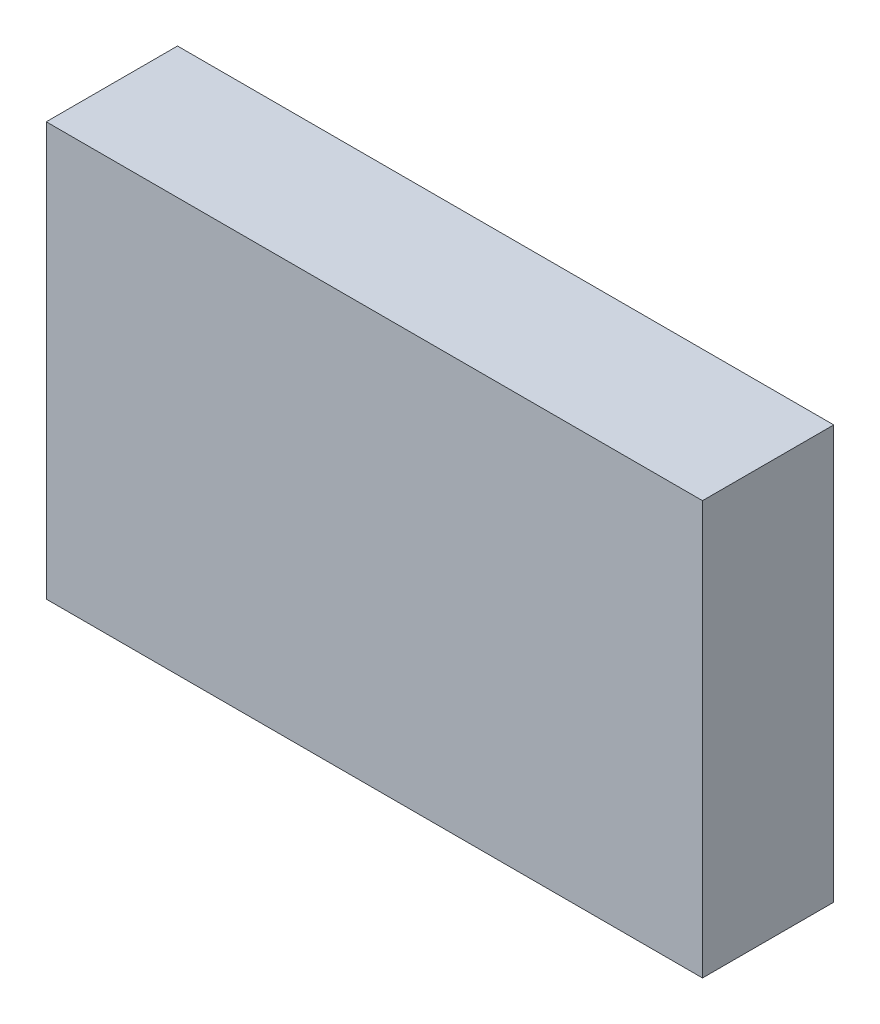
ISO-10303-21;
HEADER;
FILE_DESCRIPTION(('STEP AP214'),'2;1');
FILE_NAME('part.step','',(''),(''),'','','');
FILE_SCHEMA(('AUTOMOTIVE_DESIGN { 1 0 10303 214 1 1 1 1 }'));
ENDSEC;
DATA;
#1=APPLICATION_CONTEXT('core data for automotive mechanical design processes');
#2=APPLICATION_PROTOCOL_DEFINITION('international standard','automotive_design',2000,#1);
#3=PRODUCT_CONTEXT('',#1,'mechanical');
#4=PRODUCT('Part','Part','',(#3));
#5=PRODUCT_RELATED_PRODUCT_CATEGORY('part','',(#4));
#6=PRODUCT_DEFINITION_FORMATION('','',#4);
#7=PRODUCT_DEFINITION_CONTEXT('part definition',#1,'design');
#8=PRODUCT_DEFINITION('design','',#6,#7);
#9=PRODUCT_DEFINITION_SHAPE('','',#8);
#10=(LENGTH_UNIT() NAMED_UNIT(*) SI_UNIT(.MILLI.,.METRE.));
#11=(NAMED_UNIT(*) PLANE_ANGLE_UNIT() SI_UNIT($,.RADIAN.));
#12=(NAMED_UNIT(*) SI_UNIT($,.STERADIAN.) SOLID_ANGLE_UNIT());
#13=UNCERTAINTY_MEASURE_WITH_UNIT(LENGTH_MEASURE(1.E-05),#10,'distance_accuracy_value','');
#14=(GEOMETRIC_REPRESENTATION_CONTEXT(3) GLOBAL_UNCERTAINTY_ASSIGNED_CONTEXT((#13)) GLOBAL_UNIT_ASSIGNED_CONTEXT((#10,
#11,#12)) REPRESENTATION_CONTEXT('',''));
#15=CARTESIAN_POINT('',(0.,0.,0.));
#16=DIRECTION('',(0.,0.,1.));
#17=DIRECTION('',(1.,0.,0.));
#18=AXIS2_PLACEMENT_3D('',#15,#16,#17);
#19=CARTESIAN_POINT('',(-3.16630136986301,8.,-1.16561643835616));
#20=DIRECTION('',(1.,0.,0.));
#21=DIRECTION('',(0.,0.,-1.));
#22=AXIS2_PLACEMENT_3D('',#19,#20,#21);
#23=PLANE('',#22);
#24=DIRECTION('',(0.,0.,1.));
#25=VECTOR('',#24,1.);
#26=CARTESIAN_POINT('',(-3.16630136986301,0.,-1.16561643835616));
#27=LINE('',#26,#25);
#28=CARTESIAN_POINT('',(-3.16630136986301,0.,-1.16561643835616));
#29=VERTEX_POINT('',#28);
#30=CARTESIAN_POINT('',(-3.16630136986301,0.,1.37438356164384));
#31=VERTEX_POINT('',#30);
#32=EDGE_CURVE('E96',#29,#31,#27,.T.);
#33=ORIENTED_EDGE('',*,*,#32,.T.);
#34=DIRECTION('',(0.,-1.,0.));
#35=VECTOR('',#34,1.);
#36=CARTESIAN_POINT('',(-3.16630136986301,8.,1.37438356164384));
#37=LINE('',#36,#35);
#38=CARTESIAN_POINT('',(-3.16630136986301,8.,1.37438356164384));
#39=VERTEX_POINT('',#38);
#40=EDGE_CURVE('E11',#39,#31,#37,.T.);
#41=ORIENTED_EDGE('',*,*,#40,.F.);
#42=DIRECTION('',(0.,0.,1.));
#43=VECTOR('',#42,1.);
#44=CARTESIAN_POINT('',(-3.16630136986301,8.,-1.16561643835616));
#45=LINE('',#44,#43);
#46=CARTESIAN_POINT('',(-3.16630136986301,8.,-1.16561643835616));
#47=VERTEX_POINT('',#46);
#48=EDGE_CURVE('E84',#47,#39,#45,.T.);
#49=ORIENTED_EDGE('',*,*,#48,.F.);
#50=DIRECTION('',(0.,-1.,0.));
#51=VECTOR('',#50,1.);
#52=CARTESIAN_POINT('',(-3.16630136986301,8.,-1.16561643835616));
#53=LINE('',#52,#51);
#54=EDGE_CURVE('E92',#47,#29,#53,.T.);
#55=ORIENTED_EDGE('',*,*,#54,.T.);
#56=EDGE_LOOP('',(#33,#41,#49,#55));
#57=FACE_BOUND('',#56,.T.);
#58=ADVANCED_FACE('F33',(#57),#23,.F.);
#59=CARTESIAN_POINT('',(-3.16630136986301,8.,1.37438356164384));
#60=DIRECTION('',(0.,0.,-1.));
#61=DIRECTION('',(-1.,0.,0.));
#62=AXIS2_PLACEMENT_3D('',#59,#60,#61);
#63=PLANE('',#62);
#64=DIRECTION('',(1.,0.,0.));
#65=VECTOR('',#64,1.);
#66=CARTESIAN_POINT('',(-3.16630136986301,0.,1.37438356164384));
#67=LINE('',#66,#65);
#68=CARTESIAN_POINT('',(9.53369863013699,0.,1.37438356164384));
#69=VERTEX_POINT('',#68);
#70=EDGE_CURVE('E88',#31,#69,#67,.T.);
#71=ORIENTED_EDGE('',*,*,#70,.T.);
#72=DIRECTION('',(0.,-1.,0.));
#73=VECTOR('',#72,1.);
#74=CARTESIAN_POINT('',(9.53369863013699,8.,1.37438356164384));
#75=LINE('',#74,#73);
#76=CARTESIAN_POINT('',(9.53369863013699,8.,1.37438356164384));
#77=VERTEX_POINT('',#76);
#78=EDGE_CURVE('E41',#77,#69,#75,.T.);
#79=ORIENTED_EDGE('',*,*,#78,.F.);
#80=DIRECTION('',(1.,0.,0.));
#81=VECTOR('',#80,1.);
#82=CARTESIAN_POINT('',(-3.16630136986301,8.,1.37438356164384));
#83=LINE('',#82,#81);
#84=EDGE_CURVE('E79',#39,#77,#83,.T.);
#85=ORIENTED_EDGE('',*,*,#84,.F.);
#86=ORIENTED_EDGE('',*,*,#40,.T.);
#87=EDGE_LOOP('',(#71,#79,#85,#86));
#88=FACE_BOUND('',#87,.T.);
#89=ADVANCED_FACE('F87',(#88),#63,.F.);
#90=CARTESIAN_POINT('',(9.53369863013699,8.,-1.16561643835616));
#91=DIRECTION('',(-1.,0.,0.));
#92=DIRECTION('',(0.,0.,1.));
#93=AXIS2_PLACEMENT_3D('',#90,#91,#92);
#94=PLANE('',#93);
#95=DIRECTION('',(0.,0.,-1.));
#96=VECTOR('',#95,1.);
#97=CARTESIAN_POINT('',(9.53369863013699,0.,-1.16561643835616));
#98=LINE('',#97,#96);
#99=CARTESIAN_POINT('',(9.53369863013699,0.,-1.16561643835616));
#100=VERTEX_POINT('',#99);
#101=EDGE_CURVE('E66',#69,#100,#98,.T.);
#102=ORIENTED_EDGE('',*,*,#101,.T.);
#103=DIRECTION('',(0.,-1.,0.));
#104=VECTOR('',#103,1.);
#105=CARTESIAN_POINT('',(9.53369863013699,8.,-1.16561643835616));
#106=LINE('',#105,#104);
#107=CARTESIAN_POINT('',(9.53369863013699,8.,-1.16561643835616));
#108=VERTEX_POINT('',#107);
#109=EDGE_CURVE('E89',#108,#100,#106,.T.);
#110=ORIENTED_EDGE('',*,*,#109,.F.);
#111=DIRECTION('',(0.,0.,-1.));
#112=VECTOR('',#111,1.);
#113=CARTESIAN_POINT('',(9.53369863013699,8.,-1.16561643835616));
#114=LINE('',#113,#112);
#115=EDGE_CURVE('E82',#77,#108,#114,.T.);
#116=ORIENTED_EDGE('',*,*,#115,.F.);
#117=ORIENTED_EDGE('',*,*,#78,.T.);
#118=EDGE_LOOP('',(#102,#110,#116,#117));
#119=FACE_BOUND('',#118,.T.);
#120=ADVANCED_FACE('F90',(#119),#94,.F.);
#121=CARTESIAN_POINT('',(-3.16630136986301,8.,-1.16561643835616));
#122=DIRECTION('',(0.,0.,1.));
#123=DIRECTION('',(1.,0.,0.));
#124=AXIS2_PLACEMENT_3D('',#121,#122,#123);
#125=PLANE('',#124);
#126=DIRECTION('',(-1.,0.,0.));
#127=VECTOR('',#126,1.);
#128=CARTESIAN_POINT('',(-3.16630136986301,0.,-1.16561643835616));
#129=LINE('',#128,#127);
#130=EDGE_CURVE('E72',#100,#29,#129,.T.);
#131=ORIENTED_EDGE('',*,*,#130,.T.);
#132=ORIENTED_EDGE('',*,*,#54,.F.);
#133=DIRECTION('',(-1.,0.,0.));
#134=VECTOR('',#133,1.);
#135=CARTESIAN_POINT('',(-3.16630136986301,8.,-1.16561643835616));
#136=LINE('',#135,#134);
#137=EDGE_CURVE('E49',#108,#47,#136,.T.);
#138=ORIENTED_EDGE('',*,*,#137,.F.);
#139=ORIENTED_EDGE('',*,*,#109,.T.);
#140=EDGE_LOOP('',(#131,#132,#138,#139));
#141=FACE_BOUND('',#140,.T.);
#142=ADVANCED_FACE('F103',(#141),#125,.F.);
#143=CARTESIAN_POINT('',(0.,8.,0.));
#144=DIRECTION('',(0.,1.,0.));
#145=DIRECTION('',(0.,0.,1.));
#146=AXIS2_PLACEMENT_3D('',#143,#144,#145);
#147=PLANE('',#146);
#148=ORIENTED_EDGE('',*,*,#48,.T.);
#149=ORIENTED_EDGE('',*,*,#84,.T.);
#150=ORIENTED_EDGE('',*,*,#115,.T.);
#151=ORIENTED_EDGE('',*,*,#137,.T.);
#152=EDGE_LOOP('',(#148,#149,#150,#151));
#153=FACE_BOUND('',#152,.T.);
#154=ADVANCED_FACE('F80',(#153),#147,.T.);
#155=CARTESIAN_POINT('',(0.,0.,0.));
#156=DIRECTION('',(0.,1.,0.));
#157=DIRECTION('',(0.,0.,1.));
#158=AXIS2_PLACEMENT_3D('',#155,#156,#157);
#159=PLANE('',#158);
#160=ORIENTED_EDGE('',*,*,#32,.F.);
#161=ORIENTED_EDGE('',*,*,#130,.F.);
#162=ORIENTED_EDGE('',*,*,#101,.F.);
#163=ORIENTED_EDGE('',*,*,#70,.F.);
#164=EDGE_LOOP('',(#160,#161,#162,#163));
#165=FACE_BOUND('',#164,.T.);
#166=ADVANCED_FACE('F106',(#165),#159,.F.);
#167=CLOSED_SHELL('',(#58,#89,#120,#142,#154,#166));
#168=MANIFOLD_SOLID_BREP('B2',#167);
#169=ADVANCED_BREP_SHAPE_REPRESENTATION('',(#18,#168),#14);
#170=SHAPE_DEFINITION_REPRESENTATION(#9,#169);
ENDSEC;
END-ISO-10303-21;
